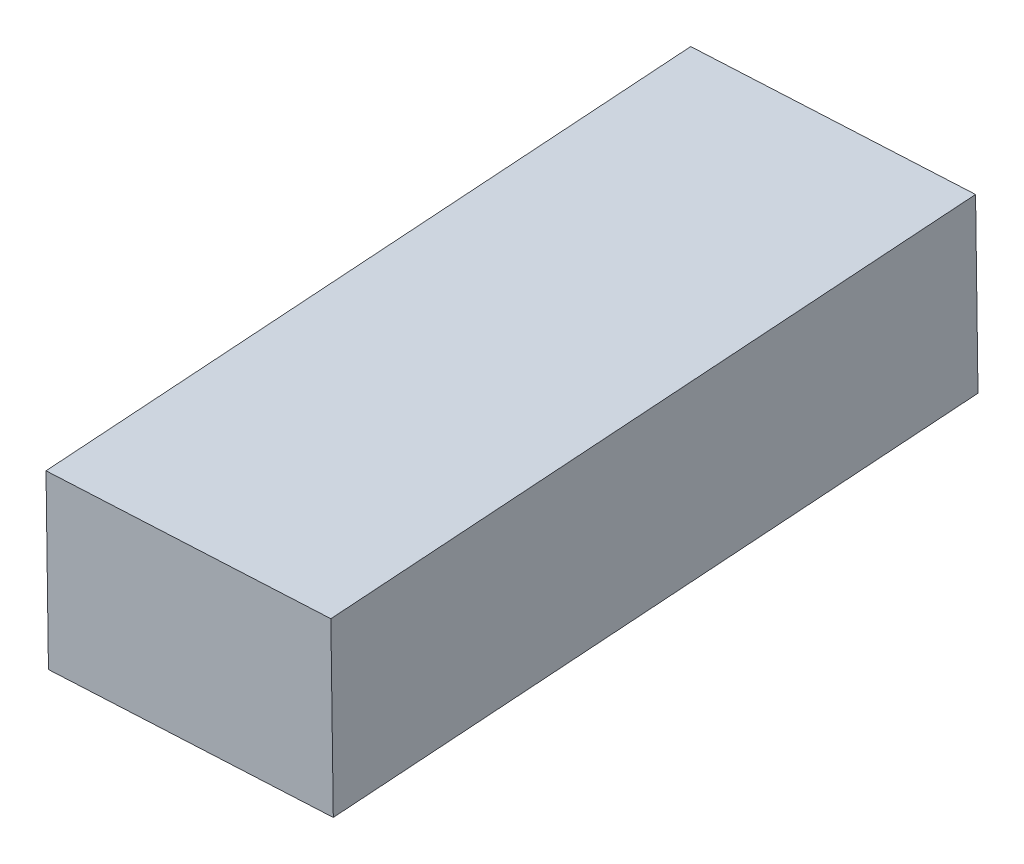
ISO-10303-21;
HEADER;
FILE_DESCRIPTION(('STEP AP214'),'2;1');
FILE_NAME('part.step','',(''),(''),'','','');
FILE_SCHEMA(('AUTOMOTIVE_DESIGN { 1 0 10303 214 1 1 1 1 }'));
ENDSEC;
DATA;
#1=APPLICATION_CONTEXT('core data for automotive mechanical design processes');
#2=APPLICATION_PROTOCOL_DEFINITION('international standard','automotive_design',2000,#1);
#3=PRODUCT_CONTEXT('',#1,'mechanical');
#4=PRODUCT('Part','Part','',(#3));
#5=PRODUCT_RELATED_PRODUCT_CATEGORY('part','',(#4));
#6=PRODUCT_DEFINITION_FORMATION('','',#4);
#7=PRODUCT_DEFINITION_CONTEXT('part definition',#1,'design');
#8=PRODUCT_DEFINITION('design','',#6,#7);
#9=PRODUCT_DEFINITION_SHAPE('','',#8);
#10=(LENGTH_UNIT() NAMED_UNIT(*) SI_UNIT(.MILLI.,.METRE.));
#11=(NAMED_UNIT(*) PLANE_ANGLE_UNIT() SI_UNIT($,.RADIAN.));
#12=(NAMED_UNIT(*) SI_UNIT($,.STERADIAN.) SOLID_ANGLE_UNIT());
#13=UNCERTAINTY_MEASURE_WITH_UNIT(LENGTH_MEASURE(1.E-05),#10,'distance_accuracy_value','');
#14=(GEOMETRIC_REPRESENTATION_CONTEXT(3) GLOBAL_UNCERTAINTY_ASSIGNED_CONTEXT((#13)) GLOBAL_UNIT_ASSIGNED_CONTEXT((#10,
#11,#12)) REPRESENTATION_CONTEXT('',''));
#15=CARTESIAN_POINT('',(0.,0.,0.));
#16=DIRECTION('',(0.,0.,1.));
#17=DIRECTION('',(1.,0.,0.));
#18=AXIS2_PLACEMENT_3D('',#15,#16,#17);
#19=CARTESIAN_POINT('',(227.521278872815,-33.5893939678504,-221.411148635988));
#20=DIRECTION('',(0.998642820034026,0.000735324908616462,-0.0520766482385934));
#21=DIRECTION('',(-1.05179721963131E-06,0.999900611525803,0.0140984775496766));
#22=AXIS2_PLACEMENT_3D('',#19,#20,#21);
#23=PLANE('',#22);
#24=DIRECTION('',(1.05179721963131E-06,-0.999900611525803,-0.0140984775496766));
#25=VECTOR('',#24,1.);
#26=CARTESIAN_POINT('',(202.053736219365,-26.7047507348621,-709.689811437445));
#27=LINE('',#26,#25);
#28=CARTESIAN_POINT('',(202.05360531975,97.736161540383,-707.935209642276));
#29=VERTEX_POINT('',#28);
#30=CARTESIAN_POINT('',(202.053867118981,-151.145663010107,-711.444413232614));
#31=VERTEX_POINT('',#30);
#32=EDGE_CURVE('E10',#29,#31,#27,.T.);
#33=ORIENTED_EDGE('',*,*,#32,.F.);
#34=DIRECTION('',(-0.0520818393816995,0.0140792886043217,-0.998543567221288));
#35=VECTOR('',#34,1.);
#36=CARTESIAN_POINT('',(227.5211479732,90.8515183073948,-219.656546840819));
#37=LINE('',#36,#35);
#38=CARTESIAN_POINT('',(252.98869062665,83.9668750744065,268.622115960638));
#39=VERTEX_POINT('',#38);
#40=EDGE_CURVE('E60',#39,#29,#37,.T.);
#41=ORIENTED_EDGE('',*,*,#40,.F.);
#42=DIRECTION('',(-1.05179721963131E-06,0.999900611525803,0.0140984775496766));
#43=VECTOR('',#42,1.);
#44=CARTESIAN_POINT('',(252.988821526266,-40.4740372008386,266.867514165469));
#45=LINE('',#44,#43);
#46=CARTESIAN_POINT('',(252.988952425881,-164.914949476084,265.1129123703));
#47=VERTEX_POINT('',#46);
#48=EDGE_CURVE('E86',#47,#39,#45,.T.);
#49=ORIENTED_EDGE('',*,*,#48,.F.);
#50=DIRECTION('',(0.0520818393816995,-0.0140792886043217,0.998543567221288));
#51=VECTOR('',#50,1.);
#52=CARTESIAN_POINT('',(227.521409772431,-158.030306243096,-223.165750431157));
#53=LINE('',#52,#51);
#54=EDGE_CURVE('E23',#31,#47,#53,.T.);
#55=ORIENTED_EDGE('',*,*,#54,.F.);
#56=EDGE_LOOP('',(#33,#41,#49,#55));
#57=FACE_BOUND('',#56,.T.);
#58=ADVANCED_FACE('F16',(#57),#23,.T.);
#59=CARTESIAN_POINT('',(-186.649767220755,-26.9909625439414,-689.419925937171));
#60=DIRECTION('',(-0.0520818393816995,0.0140792886043217,-0.998543567221288));
#61=DIRECTION('',(-0.998642820034026,-0.000735324908616462,0.0520766482385934));
#62=AXIS2_PLACEMENT_3D('',#59,#60,#61);
#63=PLANE('',#62);
#64=DIRECTION('',(0.998642820034026,0.000735324908616462,-0.0520766482385934));
#65=VECTOR('',#64,1.);
#66=CARTESIAN_POINT('',(-186.64989812037,97.4499497313037,-687.665324142002));
#67=LINE('',#66,#65);
#68=CARTESIAN_POINT('',(-186.64989812037,97.4499497313037,-687.665324142002));
#69=VERTEX_POINT('',#68);
#70=EDGE_CURVE('E53',#69,#29,#67,.T.);
#71=ORIENTED_EDGE('',*,*,#70,.T.);
#72=ORIENTED_EDGE('',*,*,#32,.T.);
#73=DIRECTION('',(0.998642820034026,0.000735324908616462,-0.0520766482385934));
#74=VECTOR('',#73,1.);
#75=CARTESIAN_POINT('',(-186.649636321139,-151.431874819187,-691.17452773234));
#76=LINE('',#75,#74);
#77=CARTESIAN_POINT('',(-186.649636321139,-151.431874819187,-691.17452773234));
#78=VERTEX_POINT('',#77);
#79=EDGE_CURVE('E66',#78,#31,#76,.T.);
#80=ORIENTED_EDGE('',*,*,#79,.F.);
#81=DIRECTION('',(-1.05179721963131E-06,0.999900611525803,0.0140984775496766));
#82=VECTOR('',#81,1.);
#83=CARTESIAN_POINT('',(-186.649767220755,-26.9909625439414,-689.419925937171));
#84=LINE('',#83,#82);
#85=EDGE_CURVE('E64',#78,#69,#84,.T.);
#86=ORIENTED_EDGE('',*,*,#85,.T.);
#87=EDGE_LOOP('',(#71,#72,#80,#86));
#88=FACE_BOUND('',#87,.T.);
#89=ADVANCED_FACE('F65',(#88),#63,.T.);
#90=CARTESIAN_POINT('',(-161.182093667689,-158.316518052175,-202.895864930883));
#91=DIRECTION('',(1.05179721963131E-06,-0.999900611525803,-0.0140984775496766));
#92=DIRECTION('',(0.998642820034026,0.000735324908616462,-0.0520766482385934));
#93=AXIS2_PLACEMENT_3D('',#90,#91,#92);
#94=PLANE('',#93);
#95=ORIENTED_EDGE('',*,*,#79,.T.);
#96=ORIENTED_EDGE('',*,*,#54,.T.);
#97=DIRECTION('',(0.998642820034026,0.000735324908616462,-0.0520766482385934));
#98=VECTOR('',#97,1.);
#99=CARTESIAN_POINT('',(-135.714551014239,-165.201161285163,285.382797870574));
#100=LINE('',#99,#98);
#101=CARTESIAN_POINT('',(-135.714551014239,-165.201161285163,285.382797870574));
#102=VERTEX_POINT('',#101);
#103=EDGE_CURVE('E81',#102,#47,#100,.T.);
#104=ORIENTED_EDGE('',*,*,#103,.F.);
#105=DIRECTION('',(-0.0520818393816995,0.0140792886043217,-0.998543567221288));
#106=VECTOR('',#105,1.);
#107=CARTESIAN_POINT('',(-161.182093667689,-158.316518052175,-202.895864930883));
#108=LINE('',#107,#106);
#109=EDGE_CURVE('E70',#102,#78,#108,.T.);
#110=ORIENTED_EDGE('',*,*,#109,.T.);
#111=EDGE_LOOP('',(#95,#96,#104,#110));
#112=FACE_BOUND('',#111,.T.);
#113=ADVANCED_FACE('F90',(#112),#94,.T.);
#114=CARTESIAN_POINT('',(-135.714681913854,-40.7602490099179,287.137399665743));
#115=DIRECTION('',(0.0520818393816995,-0.0140792886043217,0.998543567221288));
#116=DIRECTION('',(0.998642820034026,0.000735324908616462,-0.0520766482385934));
#117=AXIS2_PLACEMENT_3D('',#114,#115,#116);
#118=PLANE('',#117);
#119=ORIENTED_EDGE('',*,*,#103,.T.);
#120=ORIENTED_EDGE('',*,*,#48,.T.);
#121=DIRECTION('',(0.998642820034026,0.000735324908616462,-0.0520766482385934));
#122=VECTOR('',#121,1.);
#123=CARTESIAN_POINT('',(-135.71481281347,83.6806632653272,288.892001460912));
#124=LINE('',#123,#122);
#125=CARTESIAN_POINT('',(-135.71481281347,83.6806632653272,288.892001460912));
#126=VERTEX_POINT('',#125);
#127=EDGE_CURVE('E61',#126,#39,#124,.T.);
#128=ORIENTED_EDGE('',*,*,#127,.F.);
#129=DIRECTION('',(1.05179721963131E-06,-0.999900611525803,-0.0140984775496766));
#130=VECTOR('',#129,1.);
#131=CARTESIAN_POINT('',(-135.714681913854,-40.7602490099179,287.137399665743));
#132=LINE('',#131,#130);
#133=EDGE_CURVE('E75',#126,#102,#132,.T.);
#134=ORIENTED_EDGE('',*,*,#133,.T.);
#135=EDGE_LOOP('',(#119,#120,#128,#134));
#136=FACE_BOUND('',#135,.T.);
#137=ADVANCED_FACE('F88',(#136),#118,.T.);
#138=CARTESIAN_POINT('',(-161.182224567304,-33.8756057769297,-201.141263135714));
#139=DIRECTION('',(-0.998642820034026,-0.000735324908616462,0.0520766482385934));
#140=DIRECTION('',(1.05179721963131E-06,-0.999900611525803,-0.0140984775496766));
#141=AXIS2_PLACEMENT_3D('',#138,#139,#140);
#142=PLANE('',#141);
#143=DIRECTION('',(0.0520818393816995,-0.0140792886043217,0.998543567221288));
#144=VECTOR('',#143,1.);
#145=CARTESIAN_POINT('',(-161.18235546692,90.5653064983155,-199.386661340545));
#146=LINE('',#145,#144);
#147=EDGE_CURVE('E58',#69,#126,#146,.T.);
#148=ORIENTED_EDGE('',*,*,#147,.F.);
#149=ORIENTED_EDGE('',*,*,#85,.F.);
#150=ORIENTED_EDGE('',*,*,#109,.F.);
#151=ORIENTED_EDGE('',*,*,#133,.F.);
#152=EDGE_LOOP('',(#148,#149,#150,#151));
#153=FACE_BOUND('',#152,.T.);
#154=ADVANCED_FACE('F73',(#153),#142,.T.);
#155=CARTESIAN_POINT('',(-161.18235546692,90.5653064983155,-199.386661340545));
#156=DIRECTION('',(-1.05179721963131E-06,0.999900611525803,0.0140984775496766));
#157=DIRECTION('',(-0.998642820034026,-0.000735324908616462,0.0520766482385934));
#158=AXIS2_PLACEMENT_3D('',#155,#156,#157);
#159=PLANE('',#158);
#160=ORIENTED_EDGE('',*,*,#147,.T.);
#161=ORIENTED_EDGE('',*,*,#127,.T.);
#162=ORIENTED_EDGE('',*,*,#40,.T.);
#163=ORIENTED_EDGE('',*,*,#70,.F.);
#164=EDGE_LOOP('',(#160,#161,#162,#163));
#165=FACE_BOUND('',#164,.T.);
#166=ADVANCED_FACE('F55',(#165),#159,.T.);
#167=CLOSED_SHELL('',(#58,#89,#113,#137,#154,#166));
#168=MANIFOLD_SOLID_BREP('B1',#167);
#169=ADVANCED_BREP_SHAPE_REPRESENTATION('',(#18,#168),#14);
#170=SHAPE_DEFINITION_REPRESENTATION(#9,#169);
ENDSEC;
END-ISO-10303-21;
